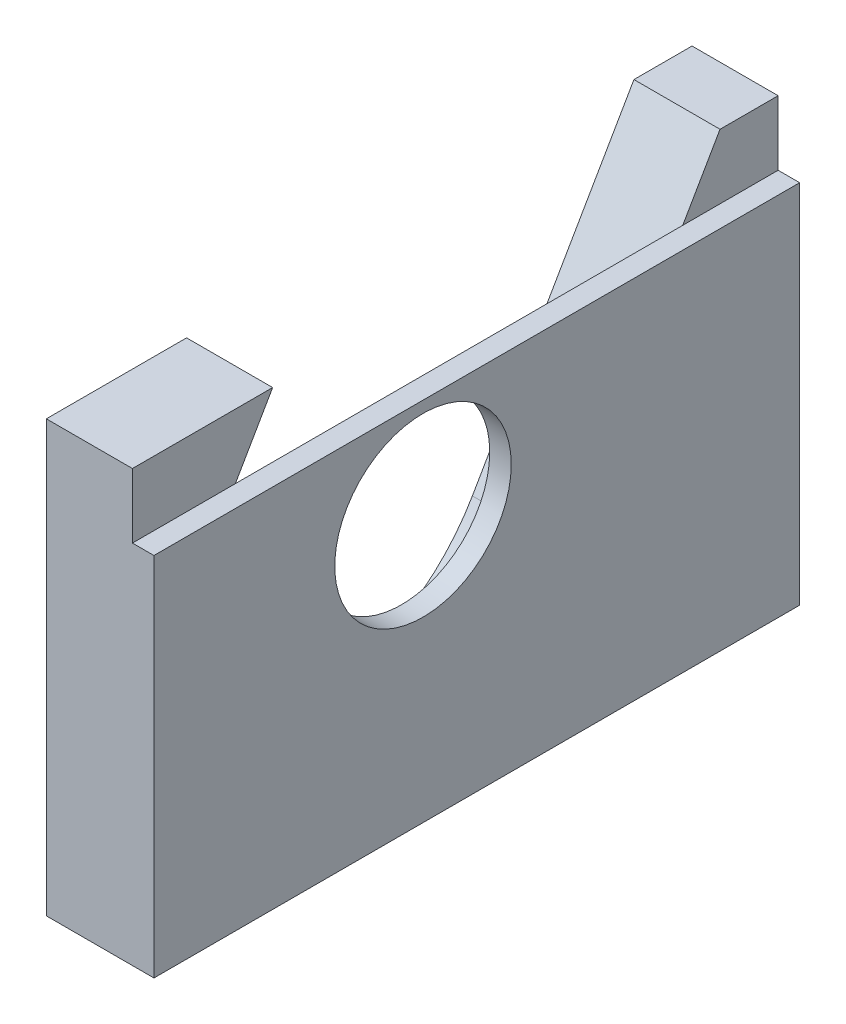
ISO-10303-21;
HEADER;
FILE_DESCRIPTION(('STEP AP214'),'2;1');
FILE_NAME('part.step','',(''),(''),'','','');
FILE_SCHEMA(('AUTOMOTIVE_DESIGN { 1 0 10303 214 1 1 1 1 }'));
ENDSEC;
DATA;
#1=APPLICATION_CONTEXT('core data for automotive mechanical design processes');
#2=APPLICATION_PROTOCOL_DEFINITION('international standard','automotive_design',2000,#1);
#3=PRODUCT_CONTEXT('',#1,'mechanical');
#4=PRODUCT('Part','Part','',(#3));
#5=PRODUCT_RELATED_PRODUCT_CATEGORY('part','',(#4));
#6=PRODUCT_DEFINITION_FORMATION('','',#4);
#7=PRODUCT_DEFINITION_CONTEXT('part definition',#1,'design');
#8=PRODUCT_DEFINITION('design','',#6,#7);
#9=PRODUCT_DEFINITION_SHAPE('','',#8);
#10=(LENGTH_UNIT() NAMED_UNIT(*) SI_UNIT(.MILLI.,.METRE.));
#11=(NAMED_UNIT(*) PLANE_ANGLE_UNIT() SI_UNIT($,.RADIAN.));
#12=(NAMED_UNIT(*) SI_UNIT($,.STERADIAN.) SOLID_ANGLE_UNIT());
#13=UNCERTAINTY_MEASURE_WITH_UNIT(LENGTH_MEASURE(1.E-05),#10,'distance_accuracy_value','');
#14=(GEOMETRIC_REPRESENTATION_CONTEXT(3) GLOBAL_UNCERTAINTY_ASSIGNED_CONTEXT((#13)) GLOBAL_UNIT_ASSIGNED_CONTEXT((#10,
#11,#12)) REPRESENTATION_CONTEXT('',''));
#15=CARTESIAN_POINT('',(0.,0.,0.));
#16=DIRECTION('',(0.,0.,1.));
#17=DIRECTION('',(1.,0.,0.));
#18=AXIS2_PLACEMENT_3D('',#15,#16,#17);
#19=CARTESIAN_POINT('',(4.,0.,0.));
#20=DIRECTION('',(-1.,0.,0.));
#21=DIRECTION('',(0.,0.,1.));
#22=AXIS2_PLACEMENT_3D('',#19,#20,#21);
#23=PLANE('',#22);
#24=DIRECTION('',(0.,0.,1.));
#25=VECTOR('',#24,1.);
#26=CARTESIAN_POINT('',(4.,17.,0.));
#27=LINE('',#26,#25);
#28=CARTESIAN_POINT('',(4.,17.,-30.));
#29=VERTEX_POINT('',#28);
#30=CARTESIAN_POINT('',(4.,17.,-25.5677313259563));
#31=VERTEX_POINT('',#30);
#32=EDGE_CURVE('E43',#29,#31,#27,.T.);
#33=ORIENTED_EDGE('',*,*,#32,.F.);
#34=DIRECTION('',(0.,1.,0.));
#35=VECTOR('',#34,1.);
#36=CARTESIAN_POINT('',(4.,0.,-30.));
#37=LINE('',#36,#35);
#38=CARTESIAN_POINT('',(4.,20.,-30.));
#39=VERTEX_POINT('',#38);
#40=EDGE_CURVE('E180',#29,#39,#37,.T.);
#41=ORIENTED_EDGE('',*,*,#40,.T.);
#42=DIRECTION('',(0.,0.,1.));
#43=VECTOR('',#42,1.);
#44=CARTESIAN_POINT('',(4.,20.,0.));
#45=LINE('',#44,#43);
#46=CARTESIAN_POINT('',(4.,20.,-27.2997821335252));
#47=VERTEX_POINT('',#46);
#48=EDGE_CURVE('E184',#39,#47,#45,.T.);
#49=ORIENTED_EDGE('',*,*,#48,.T.);
#50=DIRECTION('',(0.,0.866025403784436,-0.500000000000004));
#51=VECTOR('',#50,1.);
#52=CARTESIAN_POINT('',(4.,6.99999999999996,-19.7942286340599));
#53=LINE('',#52,#51);
#54=EDGE_CURVE('E51',#31,#47,#53,.T.);
#55=ORIENTED_EDGE('',*,*,#54,.F.);
#56=EDGE_LOOP('',(#33,#41,#49,#55));
#57=FACE_BOUND('',#56,.T.);
#58=ADVANCED_FACE('F33',(#57),#23,.F.);
#59=CARTESIAN_POINT('',(4.,17.,-4.78312163512968));
#60=VERTEX_POINT('',#59);
#61=CARTESIAN_POINT('',(4.,17.,0.));
#62=VERTEX_POINT('',#61);
#63=EDGE_CURVE('E11',#60,#62,#27,.T.);
#64=ORIENTED_EDGE('',*,*,#63,.F.);
#65=DIRECTION('',(0.,-0.866025403784436,0.500000000000004));
#66=VECTOR('',#65,1.);
#67=CARTESIAN_POINT('',(4.,16.,-4.20577136594007));
#68=LINE('',#67,#66);
#69=CARTESIAN_POINT('',(4.,20.,-6.51517244269858));
#70=VERTEX_POINT('',#69);
#71=EDGE_CURVE('E157',#70,#60,#68,.T.);
#72=ORIENTED_EDGE('',*,*,#71,.F.);
#73=CARTESIAN_POINT('',(4.,20.,0.));
#74=VERTEX_POINT('',#73);
#75=EDGE_CURVE('E183',#70,#74,#45,.T.);
#76=ORIENTED_EDGE('',*,*,#75,.T.);
#77=DIRECTION('',(0.,-1.,0.));
#78=VECTOR('',#77,1.);
#79=CARTESIAN_POINT('',(4.,0.,0.));
#80=LINE('',#79,#78);
#81=EDGE_CURVE('E178',#74,#62,#80,.T.);
#82=ORIENTED_EDGE('',*,*,#81,.T.);
#83=EDGE_LOOP('',(#64,#72,#76,#82));
#84=FACE_BOUND('',#83,.T.);
#85=ADVANCED_FACE('F218',(#84),#23,.F.);
#86=CARTESIAN_POINT('',(4.,20.,0.));
#87=DIRECTION('',(0.,-1.,0.));
#88=DIRECTION('',(0.,0.,-1.));
#89=AXIS2_PLACEMENT_3D('',#86,#87,#88);
#90=PLANE('',#89);
#91=ORIENTED_EDGE('',*,*,#75,.F.);
#92=DIRECTION('',(-1.,0.,0.));
#93=VECTOR('',#92,1.);
#94=CARTESIAN_POINT('',(4.,20.,-6.51517244269858));
#95=LINE('',#94,#93);
#96=CARTESIAN_POINT('',(0.,20.,-6.51517244269858));
#97=VERTEX_POINT('',#96);
#98=EDGE_CURVE('E175',#70,#97,#95,.T.);
#99=ORIENTED_EDGE('',*,*,#98,.T.);
#100=DIRECTION('',(0.,0.,1.));
#101=VECTOR('',#100,1.);
#102=CARTESIAN_POINT('',(0.,20.,0.));
#103=LINE('',#102,#101);
#104=CARTESIAN_POINT('',(0.,20.,0.));
#105=VERTEX_POINT('',#104);
#106=EDGE_CURVE('E192',#97,#105,#103,.T.);
#107=ORIENTED_EDGE('',*,*,#106,.T.);
#108=DIRECTION('',(-1.,0.,0.));
#109=VECTOR('',#108,1.);
#110=CARTESIAN_POINT('',(4.,20.,0.));
#111=LINE('',#110,#109);
#112=EDGE_CURVE('E186',#74,#105,#111,.T.);
#113=ORIENTED_EDGE('',*,*,#112,.F.);
#114=EDGE_LOOP('',(#91,#99,#107,#113));
#115=FACE_BOUND('',#114,.T.);
#116=ADVANCED_FACE('F222',(#115),#90,.F.);
#117=CARTESIAN_POINT('',(4.,0.,0.));
#118=DIRECTION('',(0.,0.,-1.));
#119=DIRECTION('',(-1.,0.,0.));
#120=AXIS2_PLACEMENT_3D('',#117,#118,#119);
#121=PLANE('',#120);
#122=DIRECTION('',(0.,-1.,0.));
#123=VECTOR('',#122,1.);
#124=CARTESIAN_POINT('',(0.,0.,0.));
#125=LINE('',#124,#123);
#126=CARTESIAN_POINT('',(0.,0.,0.));
#127=VERTEX_POINT('',#126);
#128=EDGE_CURVE('E125',#105,#127,#125,.T.);
#129=ORIENTED_EDGE('',*,*,#128,.T.);
#130=DIRECTION('',(-1.,0.,0.));
#131=VECTOR('',#130,1.);
#132=CARTESIAN_POINT('',(4.,0.,0.));
#133=LINE('',#132,#131);
#134=CARTESIAN_POINT('',(5.,0.,0.));
#135=VERTEX_POINT('',#134);
#136=EDGE_CURVE('E118',#135,#127,#133,.T.);
#137=ORIENTED_EDGE('',*,*,#136,.F.);
#138=DIRECTION('',(0.,-1.,0.));
#139=VECTOR('',#138,1.);
#140=CARTESIAN_POINT('',(5.,0.,0.));
#141=LINE('',#140,#139);
#142=CARTESIAN_POINT('',(5.,17.,0.));
#143=VERTEX_POINT('',#142);
#144=EDGE_CURVE('E122',#143,#135,#141,.T.);
#145=ORIENTED_EDGE('',*,*,#144,.F.);
#146=DIRECTION('',(-1.,0.,0.));
#147=VECTOR('',#146,1.);
#148=CARTESIAN_POINT('',(5.,17.,0.));
#149=LINE('',#148,#147);
#150=EDGE_CURVE('E146',#143,#62,#149,.T.);
#151=ORIENTED_EDGE('',*,*,#150,.T.);
#152=ORIENTED_EDGE('',*,*,#81,.F.);
#153=ORIENTED_EDGE('',*,*,#112,.T.);
#154=EDGE_LOOP('',(#129,#137,#145,#151,#152,#153));
#155=FACE_BOUND('',#154,.T.);
#156=ADVANCED_FACE('F35',(#155),#121,.F.);
#157=CARTESIAN_POINT('',(4.,0.,0.));
#158=DIRECTION('',(0.,1.,0.));
#159=DIRECTION('',(0.,0.,1.));
#160=AXIS2_PLACEMENT_3D('',#157,#158,#159);
#161=PLANE('',#160);
#162=DIRECTION('',(0.,0.,-1.));
#163=VECTOR('',#162,1.);
#164=CARTESIAN_POINT('',(0.,0.,0.));
#165=LINE('',#164,#163);
#166=CARTESIAN_POINT('',(0.,0.,-30.));
#167=VERTEX_POINT('',#166);
#168=EDGE_CURVE('E188',#127,#167,#165,.T.);
#169=ORIENTED_EDGE('',*,*,#168,.T.);
#170=DIRECTION('',(-1.,0.,0.));
#171=VECTOR('',#170,1.);
#172=CARTESIAN_POINT('',(4.,0.,-30.));
#173=LINE('',#172,#171);
#174=CARTESIAN_POINT('',(5.,0.,-30.));
#175=VERTEX_POINT('',#174);
#176=EDGE_CURVE('E127',#175,#167,#173,.T.);
#177=ORIENTED_EDGE('',*,*,#176,.F.);
#178=DIRECTION('',(0.,0.,-1.));
#179=VECTOR('',#178,1.);
#180=CARTESIAN_POINT('',(5.,0.,0.));
#181=LINE('',#180,#179);
#182=EDGE_CURVE('E129',#135,#175,#181,.T.);
#183=ORIENTED_EDGE('',*,*,#182,.F.);
#184=ORIENTED_EDGE('',*,*,#136,.T.);
#185=EDGE_LOOP('',(#169,#177,#183,#184));
#186=FACE_BOUND('',#185,.T.);
#187=ADVANCED_FACE('F130',(#186),#161,.F.);
#188=CARTESIAN_POINT('',(4.,0.,-30.));
#189=DIRECTION('',(0.,0.,1.));
#190=DIRECTION('',(1.,0.,0.));
#191=AXIS2_PLACEMENT_3D('',#188,#189,#190);
#192=PLANE('',#191);
#193=DIRECTION('',(0.,1.,0.));
#194=VECTOR('',#193,1.);
#195=CARTESIAN_POINT('',(0.,0.,-30.));
#196=LINE('',#195,#194);
#197=CARTESIAN_POINT('',(0.,20.,-30.));
#198=VERTEX_POINT('',#197);
#199=EDGE_CURVE('E190',#167,#198,#196,.T.);
#200=ORIENTED_EDGE('',*,*,#199,.T.);
#201=DIRECTION('',(-1.,0.,0.));
#202=VECTOR('',#201,1.);
#203=CARTESIAN_POINT('',(4.,20.,-30.));
#204=LINE('',#203,#202);
#205=EDGE_CURVE('E196',#39,#198,#204,.T.);
#206=ORIENTED_EDGE('',*,*,#205,.F.);
#207=ORIENTED_EDGE('',*,*,#40,.F.);
#208=DIRECTION('',(-1.,0.,0.));
#209=VECTOR('',#208,1.);
#210=CARTESIAN_POINT('',(5.,17.,-30.));
#211=LINE('',#210,#209);
#212=CARTESIAN_POINT('',(5.,17.,-30.));
#213=VERTEX_POINT('',#212);
#214=EDGE_CURVE('E149',#213,#29,#211,.T.);
#215=ORIENTED_EDGE('',*,*,#214,.F.);
#216=DIRECTION('',(0.,1.,0.));
#217=VECTOR('',#216,1.);
#218=CARTESIAN_POINT('',(5.,0.,-30.));
#219=LINE('',#218,#217);
#220=EDGE_CURVE('E134',#175,#213,#219,.T.);
#221=ORIENTED_EDGE('',*,*,#220,.F.);
#222=ORIENTED_EDGE('',*,*,#176,.T.);
#223=EDGE_LOOP('',(#200,#206,#207,#215,#221,#222));
#224=FACE_BOUND('',#223,.T.);
#225=ADVANCED_FACE('F201',(#224),#192,.F.);
#226=CARTESIAN_POINT('',(0.,20.,-27.2997821335252));
#227=VERTEX_POINT('',#226);
#228=EDGE_CURVE('E181',#198,#227,#103,.T.);
#229=ORIENTED_EDGE('',*,*,#228,.T.);
#230=DIRECTION('',(1.,0.,0.));
#231=VECTOR('',#230,1.);
#232=CARTESIAN_POINT('',(4.,20.,-27.2997821335252));
#233=LINE('',#232,#231);
#234=EDGE_CURVE('E171',#227,#47,#233,.T.);
#235=ORIENTED_EDGE('',*,*,#234,.T.);
#236=ORIENTED_EDGE('',*,*,#48,.F.);
#237=ORIENTED_EDGE('',*,*,#205,.T.);
#238=EDGE_LOOP('',(#229,#235,#236,#237));
#239=FACE_BOUND('',#238,.T.);
#240=ADVANCED_FACE('F210',(#239),#90,.F.);
#241=CARTESIAN_POINT('',(0.,0.,0.));
#242=DIRECTION('',(-1.,0.,0.));
#243=DIRECTION('',(0.,0.,1.));
#244=AXIS2_PLACEMENT_3D('',#241,#242,#243);
#245=PLANE('',#244);
#246=DIRECTION('',(0.,0.866025403784436,-0.500000000000004));
#247=VECTOR('',#246,1.);
#248=CARTESIAN_POINT('',(0.,2.17884757729342,3.77387470582052));
#249=LINE('',#248,#247);
#250=CARTESIAN_POINT('',(0.,16.,-4.20577136594007));
#251=VERTEX_POINT('',#250);
#252=EDGE_CURVE('E37',#251,#97,#249,.T.);
#253=ORIENTED_EDGE('',*,*,#252,.F.);
#254=CARTESIAN_POINT('',(0.,11.5,-12.));
#255=DIRECTION('',(1.,0.,0.));
#256=DIRECTION('',(0.,0.,-1.));
#257=AXIS2_PLACEMENT_3D('',#254,#255,#256);
#258=CIRCLE('',#257,9.);
#259=CARTESIAN_POINT('',(0.,6.99999999999996,-19.7942286340599));
#260=VERTEX_POINT('',#259);
#261=EDGE_CURVE('E153',#251,#260,#258,.T.);
#262=ORIENTED_EDGE('',*,*,#261,.T.);
#263=DIRECTION('',(0.,0.866025403784436,-0.500000000000004));
#264=VECTOR('',#263,1.);
#265=CARTESIAN_POINT('',(0.,6.99999999999996,-19.7942286340599));
#266=LINE('',#265,#264);
#267=EDGE_CURVE('E156',#260,#227,#266,.T.);
#268=ORIENTED_EDGE('',*,*,#267,.T.);
#269=ORIENTED_EDGE('',*,*,#228,.F.);
#270=ORIENTED_EDGE('',*,*,#199,.F.);
#271=ORIENTED_EDGE('',*,*,#168,.F.);
#272=ORIENTED_EDGE('',*,*,#128,.F.);
#273=ORIENTED_EDGE('',*,*,#106,.F.);
#274=EDGE_LOOP('',(#253,#262,#268,#269,#270,#271,#272,#273));
#275=FACE_BOUND('',#274,.T.);
#276=ADVANCED_FACE('F207',(#275),#245,.T.);
#277=CARTESIAN_POINT('',(0.,16.,-4.20577136594007));
#278=DIRECTION('',(0.,0.500000000000004,0.866025403784436));
#279=DIRECTION('',(0.,-0.866025403784436,0.500000000000004));
#280=AXIS2_PLACEMENT_3D('',#277,#278,#279);
#281=PLANE('',#280);
#282=ORIENTED_EDGE('',*,*,#71,.T.);
#283=CARTESIAN_POINT('',(4.,16.,-4.20577136594007));
#284=VERTEX_POINT('',#283);
#285=EDGE_CURVE('E165',#60,#284,#68,.T.);
#286=ORIENTED_EDGE('',*,*,#285,.T.);
#287=DIRECTION('',(1.,0.,0.));
#288=VECTOR('',#287,1.);
#289=CARTESIAN_POINT('',(0.,16.,-4.20577136594007));
#290=LINE('',#289,#288);
#291=EDGE_CURVE('E168',#251,#284,#290,.T.);
#292=ORIENTED_EDGE('',*,*,#291,.F.);
#293=ORIENTED_EDGE('',*,*,#252,.T.);
#294=ORIENTED_EDGE('',*,*,#98,.F.);
#295=EDGE_LOOP('',(#282,#286,#292,#293,#294));
#296=FACE_BOUND('',#295,.T.);
#297=ADVANCED_FACE('F226',(#296),#281,.F.);
#298=CARTESIAN_POINT('',(0.,6.99999999999996,-19.7942286340599));
#299=DIRECTION('',(0.,-0.500000000000004,-0.866025403784436));
#300=DIRECTION('',(0.,0.866025403784436,-0.500000000000004));
#301=AXIS2_PLACEMENT_3D('',#298,#299,#300);
#302=PLANE('',#301);
#303=ORIENTED_EDGE('',*,*,#267,.F.);
#304=DIRECTION('',(1.,0.,0.));
#305=VECTOR('',#304,1.);
#306=CARTESIAN_POINT('',(0.,6.99999999999996,-19.7942286340599));
#307=LINE('',#306,#305);
#308=CARTESIAN_POINT('',(4.,6.99999999999996,-19.7942286340599));
#309=VERTEX_POINT('',#308);
#310=EDGE_CURVE('E160',#260,#309,#307,.T.);
#311=ORIENTED_EDGE('',*,*,#310,.T.);
#312=EDGE_CURVE('E163',#309,#31,#53,.T.);
#313=ORIENTED_EDGE('',*,*,#312,.T.);
#314=ORIENTED_EDGE('',*,*,#54,.T.);
#315=ORIENTED_EDGE('',*,*,#234,.F.);
#316=EDGE_LOOP('',(#303,#311,#313,#314,#315));
#317=FACE_BOUND('',#316,.T.);
#318=ADVANCED_FACE('F233',(#317),#302,.F.);
#319=CARTESIAN_POINT('',(0.,11.5,-12.));
#320=DIRECTION('',(1.,0.,0.));
#321=DIRECTION('',(0.,0.,-1.));
#322=AXIS2_PLACEMENT_3D('',#319,#320,#321);
#323=CYLINDRICAL_SURFACE('',#322,9.);
#324=CARTESIAN_POINT('',(4.,11.5,-12.));
#325=DIRECTION('',(1.,0.,0.));
#326=DIRECTION('',(0.,0.,-1.));
#327=AXIS2_PLACEMENT_3D('',#324,#325,#326);
#328=CIRCLE('',#327,9.);
#329=EDGE_CURVE('E152',#284,#309,#328,.T.);
#330=ORIENTED_EDGE('',*,*,#329,.T.);
#331=ORIENTED_EDGE('',*,*,#310,.F.);
#332=ORIENTED_EDGE('',*,*,#261,.F.);
#333=ORIENTED_EDGE('',*,*,#291,.T.);
#334=EDGE_LOOP('',(#330,#331,#332,#333));
#335=FACE_BOUND('',#334,.T.);
#336=ADVANCED_FACE('F230',(#335),#323,.F.);
#337=CARTESIAN_POINT('',(4.,0.,0.));
#338=DIRECTION('',(-1.,0.,0.));
#339=DIRECTION('',(0.,0.,1.));
#340=AXIS2_PLACEMENT_3D('',#337,#338,#339);
#341=PLANE('',#340);
#342=CARTESIAN_POINT('',(4.,12.3660254037845,-12.4999999999999));
#343=DIRECTION('',(-1.,0.,0.));
#344=DIRECTION('',(0.,0.,1.));
#345=AXIS2_PLACEMENT_3D('',#342,#343,#344);
#346=CIRCLE('',#345,4.1);
#347=CARTESIAN_POINT('',(4.,12.3660254037845,-8.39999999999993));
#348=VERTEX_POINT('',#347);
#349=EDGE_CURVE('E142',#348,#348,#346,.T.);
#350=ORIENTED_EDGE('',*,*,#349,.F.);
#351=EDGE_LOOP('',(#350));
#352=FACE_BOUND('',#351,.T.);
#353=ORIENTED_EDGE('',*,*,#285,.F.);
#354=EDGE_CURVE('E44',#31,#60,#27,.T.);
#355=ORIENTED_EDGE('',*,*,#354,.F.);
#356=ORIENTED_EDGE('',*,*,#312,.F.);
#357=ORIENTED_EDGE('',*,*,#329,.F.);
#358=EDGE_LOOP('',(#353,#355,#356,#357));
#359=FACE_BOUND('',#358,.T.);
#360=ADVANCED_FACE('F236',(#352,#359),#341,.T.);
#361=CARTESIAN_POINT('',(5.,17.,0.));
#362=DIRECTION('',(0.,-1.,0.));
#363=DIRECTION('',(0.,0.,-1.));
#364=AXIS2_PLACEMENT_3D('',#361,#362,#363);
#365=PLANE('',#364);
#366=ORIENTED_EDGE('',*,*,#32,.T.);
#367=ORIENTED_EDGE('',*,*,#354,.T.);
#368=ORIENTED_EDGE('',*,*,#63,.T.);
#369=ORIENTED_EDGE('',*,*,#150,.F.);
#370=DIRECTION('',(0.,0.,1.));
#371=VECTOR('',#370,1.);
#372=CARTESIAN_POINT('',(5.,17.,0.));
#373=LINE('',#372,#371);
#374=EDGE_CURVE('E138',#213,#143,#373,.T.);
#375=ORIENTED_EDGE('',*,*,#374,.F.);
#376=ORIENTED_EDGE('',*,*,#214,.T.);
#377=EDGE_LOOP('',(#366,#367,#368,#369,#375,#376));
#378=FACE_BOUND('',#377,.T.);
#379=ADVANCED_FACE('F213',(#378),#365,.F.);
#380=CARTESIAN_POINT('',(5.,0.,0.));
#381=DIRECTION('',(-1.,0.,0.));
#382=DIRECTION('',(0.,0.,1.));
#383=AXIS2_PLACEMENT_3D('',#380,#381,#382);
#384=PLANE('',#383);
#385=CARTESIAN_POINT('',(5.,12.3660254037845,-12.4999999999999));
#386=DIRECTION('',(1.,0.,0.));
#387=DIRECTION('',(0.,0.,-1.));
#388=AXIS2_PLACEMENT_3D('',#385,#386,#387);
#389=CIRCLE('',#388,4.1);
#390=CARTESIAN_POINT('',(5.,12.3660254037845,-16.5999999999999));
#391=VERTEX_POINT('',#390);
#392=EDGE_CURVE('E238',#391,#391,#389,.T.);
#393=ORIENTED_EDGE('',*,*,#392,.F.);
#394=EDGE_LOOP('',(#393));
#395=FACE_BOUND('',#394,.T.);
#396=ORIENTED_EDGE('',*,*,#144,.T.);
#397=ORIENTED_EDGE('',*,*,#182,.T.);
#398=ORIENTED_EDGE('',*,*,#220,.T.);
#399=ORIENTED_EDGE('',*,*,#374,.T.);
#400=EDGE_LOOP('',(#396,#397,#398,#399));
#401=FACE_BOUND('',#400,.T.);
#402=ADVANCED_FACE('F136',(#395,#401),#384,.F.);
#403=CARTESIAN_POINT('',(0.,12.3660254037845,-12.4999999999999));
#404=DIRECTION('',(1.,0.,0.));
#405=DIRECTION('',(0.,0.,-1.));
#406=AXIS2_PLACEMENT_3D('',#403,#404,#405);
#407=CYLINDRICAL_SURFACE('',#406,4.1);
#408=ORIENTED_EDGE('',*,*,#349,.T.);
#409=EDGE_LOOP('',(#408));
#410=FACE_BOUND('',#409,.T.);
#411=ORIENTED_EDGE('',*,*,#392,.T.);
#412=EDGE_LOOP('',(#411));
#413=FACE_BOUND('',#412,.T.);
#414=ADVANCED_FACE('F244',(#410,#413),#407,.F.);
#415=CLOSED_SHELL('',(#58,#85,#116,#156,#187,#225,#240,#276,#297,#318,#336,#360,#379,#402,#414));
#416=MANIFOLD_SOLID_BREP('B2',#415);
#417=ADVANCED_BREP_SHAPE_REPRESENTATION('',(#18,#416),#14);
#418=SHAPE_DEFINITION_REPRESENTATION(#9,#417);
ENDSEC;
END-ISO-10303-21;
